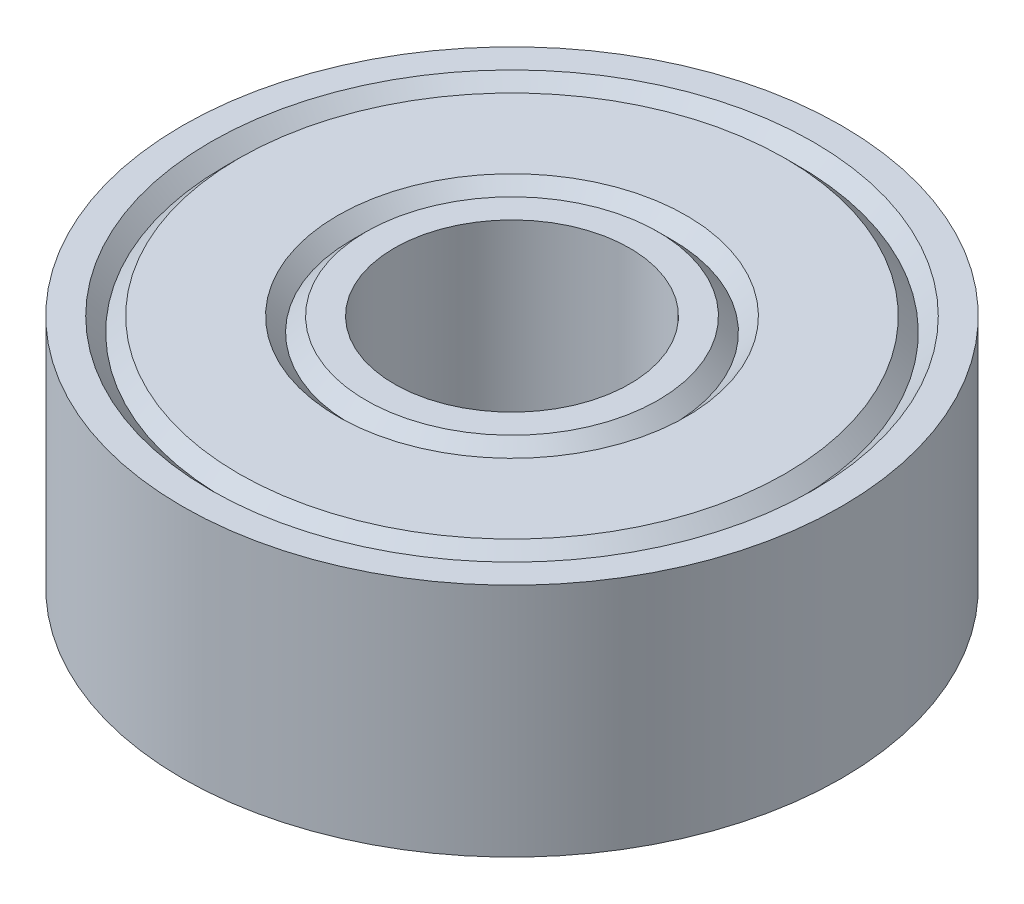
ISO-10303-21;
HEADER;
FILE_DESCRIPTION(('STEP AP214'),'2;1');
FILE_NAME('part.step','',(''),(''),'','','');
FILE_SCHEMA(('AUTOMOTIVE_DESIGN { 1 0 10303 214 1 1 1 1 }'));
ENDSEC;
DATA;
#1=APPLICATION_CONTEXT('core data for automotive mechanical design processes');
#2=APPLICATION_PROTOCOL_DEFINITION('international standard','automotive_design',2000,#1);
#3=PRODUCT_CONTEXT('',#1,'mechanical');
#4=PRODUCT('Part','Part','',(#3));
#5=PRODUCT_RELATED_PRODUCT_CATEGORY('part','',(#4));
#6=PRODUCT_DEFINITION_FORMATION('','',#4);
#7=PRODUCT_DEFINITION_CONTEXT('part definition',#1,'design');
#8=PRODUCT_DEFINITION('design','',#6,#7);
#9=PRODUCT_DEFINITION_SHAPE('','',#8);
#10=(LENGTH_UNIT() NAMED_UNIT(*) SI_UNIT(.MILLI.,.METRE.));
#11=(NAMED_UNIT(*) PLANE_ANGLE_UNIT() SI_UNIT($,.RADIAN.));
#12=(NAMED_UNIT(*) SI_UNIT($,.STERADIAN.) SOLID_ANGLE_UNIT());
#13=UNCERTAINTY_MEASURE_WITH_UNIT(LENGTH_MEASURE(1.E-05),#10,'distance_accuracy_value','');
#14=(GEOMETRIC_REPRESENTATION_CONTEXT(3) GLOBAL_UNCERTAINTY_ASSIGNED_CONTEXT((#13)) GLOBAL_UNIT_ASSIGNED_CONTEXT((#10,
#11,#12)) REPRESENTATION_CONTEXT('',''));
#15=CARTESIAN_POINT('',(0.,0.,0.));
#16=DIRECTION('',(0.,0.,1.));
#17=DIRECTION('',(1.,0.,0.));
#18=AXIS2_PLACEMENT_3D('',#15,#16,#17);
#19=CARTESIAN_POINT('',(0.,2.5,0.));
#20=DIRECTION('',(0.,1.,0.));
#21=DIRECTION('',(-1.,0.,0.));
#22=AXIS2_PLACEMENT_3D('',#19,#20,#21);
#23=CYLINDRICAL_SURFACE('',#22,2.5);
#24=CARTESIAN_POINT('',(0.,2.5,0.));
#25=DIRECTION('',(0.,1.,0.));
#26=DIRECTION('',(-1.,0.,0.));
#27=AXIS2_PLACEMENT_3D('',#24,#25,#26);
#28=CIRCLE('',#27,2.5);
#29=CARTESIAN_POINT('',(-2.5,2.5,0.));
#30=VERTEX_POINT('',#29);
#31=EDGE_CURVE('E83',#30,#30,#28,.T.);
#32=ORIENTED_EDGE('',*,*,#31,.T.);
#33=EDGE_LOOP('',(#32));
#34=FACE_BOUND('',#33,.T.);
#35=CARTESIAN_POINT('',(0.,-2.5,0.));
#36=DIRECTION('',(0.,1.,0.));
#37=DIRECTION('',(-1.,0.,0.));
#38=AXIS2_PLACEMENT_3D('',#35,#36,#37);
#39=CIRCLE('',#38,2.5);
#40=CARTESIAN_POINT('',(-2.5,-2.5,0.));
#41=VERTEX_POINT('',#40);
#42=EDGE_CURVE('E10',#41,#41,#39,.T.);
#43=ORIENTED_EDGE('',*,*,#42,.F.);
#44=EDGE_LOOP('',(#43));
#45=FACE_BOUND('',#44,.T.);
#46=ADVANCED_FACE('F31',(#34,#45),#23,.F.);
#47=CARTESIAN_POINT('',(-2.5,-2.5,0.));
#48=DIRECTION('',(0.,-1.,0.));
#49=DIRECTION('',(1.,0.,0.));
#50=AXIS2_PLACEMENT_3D('',#47,#48,#49);
#51=PLANE('',#50);
#52=ORIENTED_EDGE('',*,*,#42,.T.);
#53=EDGE_LOOP('',(#52));
#54=FACE_BOUND('',#53,.T.);
#55=CARTESIAN_POINT('',(0.,-2.5,0.));
#56=DIRECTION('',(0.,1.,0.));
#57=DIRECTION('',(-1.,0.,0.));
#58=AXIS2_PLACEMENT_3D('',#55,#56,#57);
#59=CIRCLE('',#58,3.1);
#60=CARTESIAN_POINT('',(-3.1,-2.5,0.));
#61=VERTEX_POINT('',#60);
#62=EDGE_CURVE('E37',#61,#61,#59,.T.);
#63=ORIENTED_EDGE('',*,*,#62,.F.);
#64=EDGE_LOOP('',(#63));
#65=FACE_BOUND('',#64,.T.);
#66=ADVANCED_FACE('F101',(#54,#65),#51,.T.);
#67=CARTESIAN_POINT('',(0.,-2.2,0.));
#68=DIRECTION('',(0.,1.,0.));
#69=DIRECTION('',(-1.,0.,0.));
#70=AXIS2_PLACEMENT_3D('',#67,#68,#69);
#71=CONICAL_SURFACE('',#70,3.4,0.78539816339745);
#72=ORIENTED_EDGE('',*,*,#62,.T.);
#73=EDGE_LOOP('',(#72));
#74=FACE_BOUND('',#73,.T.);
#75=CARTESIAN_POINT('',(0.,-2.2,0.));
#76=DIRECTION('',(0.,1.,0.));
#77=DIRECTION('',(-1.,0.,0.));
#78=AXIS2_PLACEMENT_3D('',#75,#76,#77);
#79=CIRCLE('',#78,3.4);
#80=CARTESIAN_POINT('',(-3.4,-2.2,0.));
#81=VERTEX_POINT('',#80);
#82=EDGE_CURVE('E41',#81,#81,#79,.T.);
#83=ORIENTED_EDGE('',*,*,#82,.F.);
#84=EDGE_LOOP('',(#83));
#85=FACE_BOUND('',#84,.T.);
#86=ADVANCED_FACE('F105',(#74,#85),#71,.T.);
#87=CARTESIAN_POINT('',(0.,-2.5,0.));
#88=DIRECTION('',(0.,-1.,0.));
#89=DIRECTION('',(1.,0.,0.));
#90=AXIS2_PLACEMENT_3D('',#87,#88,#89);
#91=CONICAL_SURFACE('',#90,3.7,0.78539816339745);
#92=ORIENTED_EDGE('',*,*,#82,.T.);
#93=EDGE_LOOP('',(#92));
#94=FACE_BOUND('',#93,.T.);
#95=CARTESIAN_POINT('',(0.,-2.5,0.));
#96=DIRECTION('',(0.,1.,0.));
#97=DIRECTION('',(-1.,0.,0.));
#98=AXIS2_PLACEMENT_3D('',#95,#96,#97);
#99=CIRCLE('',#98,3.7);
#100=CARTESIAN_POINT('',(-3.7,-2.5,0.));
#101=VERTEX_POINT('',#100);
#102=EDGE_CURVE('E45',#101,#101,#99,.T.);
#103=ORIENTED_EDGE('',*,*,#102,.F.);
#104=EDGE_LOOP('',(#103));
#105=FACE_BOUND('',#104,.T.);
#106=ADVANCED_FACE('F109',(#94,#105),#91,.F.);
#107=CARTESIAN_POINT('',(-3.7,-2.5,0.));
#108=DIRECTION('',(0.,-1.,0.));
#109=DIRECTION('',(1.,0.,0.));
#110=AXIS2_PLACEMENT_3D('',#107,#108,#109);
#111=PLANE('',#110);
#112=ORIENTED_EDGE('',*,*,#102,.T.);
#113=EDGE_LOOP('',(#112));
#114=FACE_BOUND('',#113,.T.);
#115=CARTESIAN_POINT('',(0.,-2.5,0.));
#116=DIRECTION('',(0.,1.,0.));
#117=DIRECTION('',(-1.,0.,0.));
#118=AXIS2_PLACEMENT_3D('',#115,#116,#117);
#119=CIRCLE('',#118,5.8);
#120=CARTESIAN_POINT('',(-5.8,-2.5,0.));
#121=VERTEX_POINT('',#120);
#122=EDGE_CURVE('E50',#121,#121,#119,.T.);
#123=ORIENTED_EDGE('',*,*,#122,.F.);
#124=EDGE_LOOP('',(#123));
#125=FACE_BOUND('',#124,.T.);
#126=ADVANCED_FACE('F115',(#114,#125),#111,.T.);
#127=CARTESIAN_POINT('',(0.,-2.2,0.));
#128=DIRECTION('',(0.,1.,0.));
#129=DIRECTION('',(-1.,0.,0.));
#130=AXIS2_PLACEMENT_3D('',#127,#128,#129);
#131=CONICAL_SURFACE('',#130,6.1,0.785398163397447);
#132=ORIENTED_EDGE('',*,*,#122,.T.);
#133=EDGE_LOOP('',(#132));
#134=FACE_BOUND('',#133,.T.);
#135=CARTESIAN_POINT('',(0.,-2.2,0.));
#136=DIRECTION('',(0.,1.,0.));
#137=DIRECTION('',(-1.,0.,0.));
#138=AXIS2_PLACEMENT_3D('',#135,#136,#137);
#139=CIRCLE('',#138,6.1);
#140=CARTESIAN_POINT('',(-6.1,-2.2,0.));
#141=VERTEX_POINT('',#140);
#142=EDGE_CURVE('E53',#141,#141,#139,.T.);
#143=ORIENTED_EDGE('',*,*,#142,.F.);
#144=EDGE_LOOP('',(#143));
#145=FACE_BOUND('',#144,.T.);
#146=ADVANCED_FACE('F119',(#134,#145),#131,.T.);
#147=CARTESIAN_POINT('',(0.,-2.5,0.));
#148=DIRECTION('',(0.,-1.,0.));
#149=DIRECTION('',(1.,0.,0.));
#150=AXIS2_PLACEMENT_3D('',#147,#148,#149);
#151=CONICAL_SURFACE('',#150,6.4,0.785398163397448);
#152=ORIENTED_EDGE('',*,*,#142,.T.);
#153=EDGE_LOOP('',(#152));
#154=FACE_BOUND('',#153,.T.);
#155=CARTESIAN_POINT('',(0.,-2.5,0.));
#156=DIRECTION('',(0.,1.,0.));
#157=DIRECTION('',(-1.,0.,0.));
#158=AXIS2_PLACEMENT_3D('',#155,#156,#157);
#159=CIRCLE('',#158,6.4);
#160=CARTESIAN_POINT('',(-6.4,-2.5,0.));
#161=VERTEX_POINT('',#160);
#162=EDGE_CURVE('E56',#161,#161,#159,.T.);
#163=ORIENTED_EDGE('',*,*,#162,.F.);
#164=EDGE_LOOP('',(#163));
#165=FACE_BOUND('',#164,.T.);
#166=ADVANCED_FACE('F123',(#154,#165),#151,.F.);
#167=CARTESIAN_POINT('',(-6.4,-2.5,0.));
#168=DIRECTION('',(0.,-1.,0.));
#169=DIRECTION('',(1.,0.,0.));
#170=AXIS2_PLACEMENT_3D('',#167,#168,#169);
#171=PLANE('',#170);
#172=ORIENTED_EDGE('',*,*,#162,.T.);
#173=EDGE_LOOP('',(#172));
#174=FACE_BOUND('',#173,.T.);
#175=CARTESIAN_POINT('',(0.,-2.5,0.));
#176=DIRECTION('',(0.,1.,0.));
#177=DIRECTION('',(-1.,0.,0.));
#178=AXIS2_PLACEMENT_3D('',#175,#176,#177);
#179=CIRCLE('',#178,7.);
#180=CARTESIAN_POINT('',(-7.,-2.5,0.));
#181=VERTEX_POINT('',#180);
#182=EDGE_CURVE('E59',#181,#181,#179,.T.);
#183=ORIENTED_EDGE('',*,*,#182,.F.);
#184=EDGE_LOOP('',(#183));
#185=FACE_BOUND('',#184,.T.);
#186=ADVANCED_FACE('F127',(#174,#185),#171,.T.);
#187=CARTESIAN_POINT('',(0.,2.5,0.));
#188=DIRECTION('',(0.,1.,0.));
#189=DIRECTION('',(-1.,0.,0.));
#190=AXIS2_PLACEMENT_3D('',#187,#188,#189);
#191=CYLINDRICAL_SURFACE('',#190,7.);
#192=ORIENTED_EDGE('',*,*,#182,.T.);
#193=EDGE_LOOP('',(#192));
#194=FACE_BOUND('',#193,.T.);
#195=CARTESIAN_POINT('',(0.,2.5,0.));
#196=DIRECTION('',(0.,1.,0.));
#197=DIRECTION('',(-1.,0.,0.));
#198=AXIS2_PLACEMENT_3D('',#195,#196,#197);
#199=CIRCLE('',#198,7.);
#200=CARTESIAN_POINT('',(-7.,2.5,0.));
#201=VERTEX_POINT('',#200);
#202=EDGE_CURVE('E62',#201,#201,#199,.T.);
#203=ORIENTED_EDGE('',*,*,#202,.F.);
#204=EDGE_LOOP('',(#203));
#205=FACE_BOUND('',#204,.T.);
#206=ADVANCED_FACE('F131',(#194,#205),#191,.T.);
#207=CARTESIAN_POINT('',(-6.4,2.5,0.));
#208=DIRECTION('',(0.,1.,0.));
#209=DIRECTION('',(-1.,0.,0.));
#210=AXIS2_PLACEMENT_3D('',#207,#208,#209);
#211=PLANE('',#210);
#212=ORIENTED_EDGE('',*,*,#202,.T.);
#213=EDGE_LOOP('',(#212));
#214=FACE_BOUND('',#213,.T.);
#215=CARTESIAN_POINT('',(0.,2.5,0.));
#216=DIRECTION('',(0.,1.,0.));
#217=DIRECTION('',(-1.,0.,0.));
#218=AXIS2_PLACEMENT_3D('',#215,#216,#217);
#219=CIRCLE('',#218,6.4);
#220=CARTESIAN_POINT('',(-6.4,2.5,0.));
#221=VERTEX_POINT('',#220);
#222=EDGE_CURVE('E65',#221,#221,#219,.T.);
#223=ORIENTED_EDGE('',*,*,#222,.F.);
#224=EDGE_LOOP('',(#223));
#225=FACE_BOUND('',#224,.T.);
#226=ADVANCED_FACE('F135',(#214,#225),#211,.T.);
#227=CARTESIAN_POINT('',(0.,2.2,0.));
#228=DIRECTION('',(0.,1.,0.));
#229=DIRECTION('',(-1.,0.,0.));
#230=AXIS2_PLACEMENT_3D('',#227,#228,#229);
#231=CONICAL_SURFACE('',#230,6.1,0.785398163397448);
#232=ORIENTED_EDGE('',*,*,#222,.T.);
#233=EDGE_LOOP('',(#232));
#234=FACE_BOUND('',#233,.T.);
#235=CARTESIAN_POINT('',(0.,2.2,0.));
#236=DIRECTION('',(0.,1.,0.));
#237=DIRECTION('',(-1.,0.,0.));
#238=AXIS2_PLACEMENT_3D('',#235,#236,#237);
#239=CIRCLE('',#238,6.1);
#240=CARTESIAN_POINT('',(-6.1,2.2,0.));
#241=VERTEX_POINT('',#240);
#242=EDGE_CURVE('E68',#241,#241,#239,.T.);
#243=ORIENTED_EDGE('',*,*,#242,.F.);
#244=EDGE_LOOP('',(#243));
#245=FACE_BOUND('',#244,.T.);
#246=ADVANCED_FACE('F139',(#234,#245),#231,.F.);
#247=CARTESIAN_POINT('',(0.,2.5,0.));
#248=DIRECTION('',(0.,-1.,0.));
#249=DIRECTION('',(1.,0.,0.));
#250=AXIS2_PLACEMENT_3D('',#247,#248,#249);
#251=CONICAL_SURFACE('',#250,5.8,0.785398163397446);
#252=ORIENTED_EDGE('',*,*,#242,.T.);
#253=EDGE_LOOP('',(#252));
#254=FACE_BOUND('',#253,.T.);
#255=CARTESIAN_POINT('',(0.,2.5,0.));
#256=DIRECTION('',(0.,1.,0.));
#257=DIRECTION('',(-1.,0.,0.));
#258=AXIS2_PLACEMENT_3D('',#255,#256,#257);
#259=CIRCLE('',#258,5.8);
#260=CARTESIAN_POINT('',(-5.8,2.5,0.));
#261=VERTEX_POINT('',#260);
#262=EDGE_CURVE('E71',#261,#261,#259,.T.);
#263=ORIENTED_EDGE('',*,*,#262,.F.);
#264=EDGE_LOOP('',(#263));
#265=FACE_BOUND('',#264,.T.);
#266=ADVANCED_FACE('F143',(#254,#265),#251,.T.);
#267=CARTESIAN_POINT('',(-3.7,2.5,0.));
#268=DIRECTION('',(0.,1.,0.));
#269=DIRECTION('',(-1.,0.,0.));
#270=AXIS2_PLACEMENT_3D('',#267,#268,#269);
#271=PLANE('',#270);
#272=ORIENTED_EDGE('',*,*,#262,.T.);
#273=EDGE_LOOP('',(#272));
#274=FACE_BOUND('',#273,.T.);
#275=CARTESIAN_POINT('',(0.,2.5,0.));
#276=DIRECTION('',(0.,1.,0.));
#277=DIRECTION('',(-1.,0.,0.));
#278=AXIS2_PLACEMENT_3D('',#275,#276,#277);
#279=CIRCLE('',#278,3.7);
#280=CARTESIAN_POINT('',(-3.7,2.5,0.));
#281=VERTEX_POINT('',#280);
#282=EDGE_CURVE('E74',#281,#281,#279,.T.);
#283=ORIENTED_EDGE('',*,*,#282,.F.);
#284=EDGE_LOOP('',(#283));
#285=FACE_BOUND('',#284,.T.);
#286=ADVANCED_FACE('F147',(#274,#285),#271,.T.);
#287=CARTESIAN_POINT('',(0.,2.2,0.));
#288=DIRECTION('',(0.,1.,0.));
#289=DIRECTION('',(-1.,0.,0.));
#290=AXIS2_PLACEMENT_3D('',#287,#288,#289);
#291=CONICAL_SURFACE('',#290,3.4,0.78539816339745);
#292=ORIENTED_EDGE('',*,*,#282,.T.);
#293=EDGE_LOOP('',(#292));
#294=FACE_BOUND('',#293,.T.);
#295=CARTESIAN_POINT('',(0.,2.2,0.));
#296=DIRECTION('',(0.,1.,0.));
#297=DIRECTION('',(-1.,0.,0.));
#298=AXIS2_PLACEMENT_3D('',#295,#296,#297);
#299=CIRCLE('',#298,3.4);
#300=CARTESIAN_POINT('',(-3.4,2.2,0.));
#301=VERTEX_POINT('',#300);
#302=EDGE_CURVE('E77',#301,#301,#299,.T.);
#303=ORIENTED_EDGE('',*,*,#302,.F.);
#304=EDGE_LOOP('',(#303));
#305=FACE_BOUND('',#304,.T.);
#306=ADVANCED_FACE('F97',(#294,#305),#291,.F.);
#307=CARTESIAN_POINT('',(0.,2.5,0.));
#308=DIRECTION('',(0.,-1.,0.));
#309=DIRECTION('',(1.,0.,0.));
#310=AXIS2_PLACEMENT_3D('',#307,#308,#309);
#311=CONICAL_SURFACE('',#310,3.1,0.785398163397448);
#312=ORIENTED_EDGE('',*,*,#302,.T.);
#313=EDGE_LOOP('',(#312));
#314=FACE_BOUND('',#313,.T.);
#315=CARTESIAN_POINT('',(0.,2.5,0.));
#316=DIRECTION('',(0.,1.,0.));
#317=DIRECTION('',(-1.,0.,0.));
#318=AXIS2_PLACEMENT_3D('',#315,#316,#317);
#319=CIRCLE('',#318,3.1);
#320=CARTESIAN_POINT('',(-3.1,2.5,0.));
#321=VERTEX_POINT('',#320);
#322=EDGE_CURVE('E80',#321,#321,#319,.T.);
#323=ORIENTED_EDGE('',*,*,#322,.F.);
#324=EDGE_LOOP('',(#323));
#325=FACE_BOUND('',#324,.T.);
#326=ADVANCED_FACE('F91',(#314,#325),#311,.T.);
#327=CARTESIAN_POINT('',(-2.5,2.5,0.));
#328=DIRECTION('',(0.,1.,0.));
#329=DIRECTION('',(-1.,0.,0.));
#330=AXIS2_PLACEMENT_3D('',#327,#328,#329);
#331=PLANE('',#330);
#332=ORIENTED_EDGE('',*,*,#322,.T.);
#333=EDGE_LOOP('',(#332));
#334=FACE_BOUND('',#333,.T.);
#335=ORIENTED_EDGE('',*,*,#31,.F.);
#336=EDGE_LOOP('',(#335));
#337=FACE_BOUND('',#336,.T.);
#338=ADVANCED_FACE('F89',(#334,#337),#331,.T.);
#339=CLOSED_SHELL('',(#46,#66,#86,#106,#126,#146,#166,#186,#206,#226,#246,#266,#286,#306,#326,#338));
#340=MANIFOLD_SOLID_BREP('B2',#339);
#341=ADVANCED_BREP_SHAPE_REPRESENTATION('',(#18,#340),#14);
#342=SHAPE_DEFINITION_REPRESENTATION(#9,#341);
ENDSEC;
END-ISO-10303-21;
